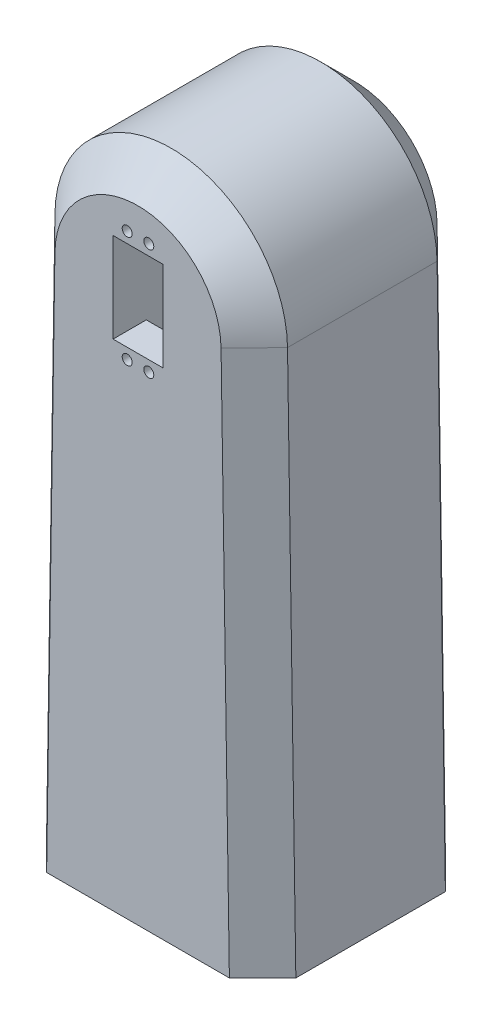
ISO-10303-21;
HEADER;
FILE_DESCRIPTION(('STEP AP214'),'2;1');
FILE_NAME('part.step','',(''),(''),'','','');
FILE_SCHEMA(('AUTOMOTIVE_DESIGN { 1 0 10303 214 1 1 1 1 }'));
ENDSEC;
DATA;
#1=APPLICATION_CONTEXT('core data for automotive mechanical design processes');
#2=APPLICATION_PROTOCOL_DEFINITION('international standard','automotive_design',2000,#1);
#3=PRODUCT_CONTEXT('',#1,'mechanical');
#4=PRODUCT('Part','Part','',(#3));
#5=PRODUCT_RELATED_PRODUCT_CATEGORY('part','',(#4));
#6=PRODUCT_DEFINITION_FORMATION('','',#4);
#7=PRODUCT_DEFINITION_CONTEXT('part definition',#1,'design');
#8=PRODUCT_DEFINITION('design','',#6,#7);
#9=PRODUCT_DEFINITION_SHAPE('','',#8);
#10=(LENGTH_UNIT() NAMED_UNIT(*) SI_UNIT(.MILLI.,.METRE.));
#11=(NAMED_UNIT(*) PLANE_ANGLE_UNIT() SI_UNIT($,.RADIAN.));
#12=(NAMED_UNIT(*) SI_UNIT($,.STERADIAN.) SOLID_ANGLE_UNIT());
#13=UNCERTAINTY_MEASURE_WITH_UNIT(LENGTH_MEASURE(1.E-05),#10,'distance_accuracy_value','');
#14=(GEOMETRIC_REPRESENTATION_CONTEXT(3) GLOBAL_UNCERTAINTY_ASSIGNED_CONTEXT((#13)) GLOBAL_UNIT_ASSIGNED_CONTEXT((#10,
#11,#12)) REPRESENTATION_CONTEXT('',''));
#15=CARTESIAN_POINT('',(0.,0.,0.));
#16=DIRECTION('',(0.,0.,1.));
#17=DIRECTION('',(1.,0.,0.));
#18=AXIS2_PLACEMENT_3D('',#15,#16,#17);
#19=CARTESIAN_POINT('',(0.,162.5,65.));
#20=DIRECTION('',(0.,0.,1.));
#21=DIRECTION('',(1.,0.,0.));
#22=AXIS2_PLACEMENT_3D('',#19,#20,#21);
#23=PLANE('',#22);
#24=CARTESIAN_POINT('',(-3.25,145.75,65.));
#25=DIRECTION('',(0.,0.,-1.));
#26=DIRECTION('',(-1.,0.,0.));
#27=AXIS2_PLACEMENT_3D('',#24,#25,#26);
#28=CIRCLE('',#27,1.5);
#29=CARTESIAN_POINT('',(-4.75000000000001,145.75,65.));
#30=VERTEX_POINT('',#29);
#31=EDGE_CURVE('E194',#30,#30,#28,.T.);
#32=ORIENTED_EDGE('',*,*,#31,.T.);
#33=EDGE_LOOP('',(#32));
#34=FACE_BOUND('',#33,.T.);
#35=CARTESIAN_POINT('',(-3.25,179.25,65.));
#36=DIRECTION('',(0.,0.,-1.));
#37=DIRECTION('',(-1.,0.,0.));
#38=AXIS2_PLACEMENT_3D('',#35,#36,#37);
#39=CIRCLE('',#38,1.5);
#40=CARTESIAN_POINT('',(-4.75000000000001,179.25,65.));
#41=VERTEX_POINT('',#40);
#42=EDGE_CURVE('E916',#41,#41,#39,.F.);
#43=ORIENTED_EDGE('',*,*,#42,.F.);
#44=EDGE_LOOP('',(#43));
#45=FACE_BOUND('',#44,.T.);
#46=CARTESIAN_POINT('',(3.25,179.25,65.));
#47=DIRECTION('',(0.,0.,-1.));
#48=DIRECTION('',(-1.,0.,0.));
#49=AXIS2_PLACEMENT_3D('',#46,#47,#48);
#50=CIRCLE('',#49,1.5);
#51=CARTESIAN_POINT('',(1.75,179.25,65.));
#52=VERTEX_POINT('',#51);
#53=EDGE_CURVE('E915',#52,#52,#50,.T.);
#54=ORIENTED_EDGE('',*,*,#53,.T.);
#55=EDGE_LOOP('',(#54));
#56=FACE_BOUND('',#55,.T.);
#57=CARTESIAN_POINT('',(0.,162.5,65.));
#58=DIRECTION('',(0.,0.,1.));
#59=DIRECTION('',(1.,0.,0.));
#60=AXIS2_PLACEMENT_3D('',#57,#58,#59);
#61=CIRCLE('',#60,24.9999999999999);
#62=CARTESIAN_POINT('',(24.997051704333,162.883935008692,65.));
#63=VERTEX_POINT('',#62);
#64=CARTESIAN_POINT('',(-24.997051704333,162.883935008692,65.));
#65=VERTEX_POINT('',#64);
#66=EDGE_CURVE('E354',#63,#65,#61,.T.);
#67=ORIENTED_EDGE('',*,*,#66,.T.);
#68=DIRECTION('',(-0.0153574003476897,-0.999882068173323,0.));
#69=VECTOR('',#68,1.);
#70=CARTESIAN_POINT('',(-27.5011793182667,-0.153574003476899,65.));
#71=LINE('',#70,#69);
#72=CARTESIAN_POINT('',(-27.4988205426376,0.,65.));
#73=VERTEX_POINT('',#72);
#74=EDGE_CURVE('E360',#65,#73,#71,.T.);
#75=ORIENTED_EDGE('',*,*,#74,.T.);
#76=DIRECTION('',(1.,0.,0.));
#77=VECTOR('',#76,1.);
#78=CARTESIAN_POINT('',(-37.5,0.,65.));
#79=LINE('',#78,#77);
#80=CARTESIAN_POINT('',(27.4988205426376,0.,65.));
#81=VERTEX_POINT('',#80);
#82=EDGE_CURVE('E289',#73,#81,#79,.T.);
#83=ORIENTED_EDGE('',*,*,#82,.T.);
#84=DIRECTION('',(-0.0153574003476897,0.999882068173323,0.));
#85=VECTOR('',#84,1.);
#86=CARTESIAN_POINT('',(24.997051704333,162.883935008692,65.));
#87=LINE('',#86,#85);
#88=EDGE_CURVE('E357',#81,#63,#87,.T.);
#89=ORIENTED_EDGE('',*,*,#88,.T.);
#90=EDGE_LOOP('',(#67,#75,#83,#89));
#91=FACE_BOUND('',#90,.T.);
#92=DIRECTION('',(0.,-1.,0.));
#93=VECTOR('',#92,1.);
#94=CARTESIAN_POINT('',(7.49999999999997,0.,65.));
#95=LINE('',#94,#93);
#96=CARTESIAN_POINT('',(7.5,176.,65.));
#97=VERTEX_POINT('',#96);
#98=CARTESIAN_POINT('',(7.49999999999999,149.,65.));
#99=VERTEX_POINT('',#98);
#100=EDGE_CURVE('E174',#97,#99,#95,.T.);
#101=ORIENTED_EDGE('',*,*,#100,.T.);
#102=DIRECTION('',(1.,0.,0.));
#103=VECTOR('',#102,1.);
#104=CARTESIAN_POINT('',(0.,149.,65.));
#105=LINE('',#104,#103);
#106=CARTESIAN_POINT('',(-7.50000000000001,149.,65.));
#107=VERTEX_POINT('',#106);
#108=EDGE_CURVE('E168',#107,#99,#105,.T.);
#109=ORIENTED_EDGE('',*,*,#108,.F.);
#110=DIRECTION('',(0.,1.,0.));
#111=VECTOR('',#110,1.);
#112=CARTESIAN_POINT('',(-7.50000000000003,0.,65.));
#113=LINE('',#112,#111);
#114=CARTESIAN_POINT('',(-7.5,176.,65.));
#115=VERTEX_POINT('',#114);
#116=EDGE_CURVE('E177',#107,#115,#113,.T.);
#117=ORIENTED_EDGE('',*,*,#116,.T.);
#118=DIRECTION('',(-1.,0.,0.));
#119=VECTOR('',#118,1.);
#120=CARTESIAN_POINT('',(0.,176.,65.));
#121=LINE('',#120,#119);
#122=EDGE_CURVE('E183',#97,#115,#121,.T.);
#123=ORIENTED_EDGE('',*,*,#122,.F.);
#124=EDGE_LOOP('',(#101,#109,#117,#123));
#125=FACE_BOUND('',#124,.T.);
#126=CARTESIAN_POINT('',(3.25,145.75,65.));
#127=DIRECTION('',(0.,0.,-1.));
#128=DIRECTION('',(-1.,0.,0.));
#129=AXIS2_PLACEMENT_3D('',#126,#127,#128);
#130=CIRCLE('',#129,1.5);
#131=CARTESIAN_POINT('',(1.75,145.75,65.));
#132=VERTEX_POINT('',#131);
#133=EDGE_CURVE('E930',#132,#132,#130,.F.);
#134=ORIENTED_EDGE('',*,*,#133,.F.);
#135=EDGE_LOOP('',(#134));
#136=FACE_BOUND('',#135,.T.);
#137=ADVANCED_FACE('F52',(#34,#45,#56,#91,#125,#136),#23,.T.);
#138=CARTESIAN_POINT('',(0.,162.5,55.));
#139=DIRECTION('',(0.,0.,1.));
#140=DIRECTION('',(1.,0.,0.));
#141=AXIS2_PLACEMENT_3D('',#138,#139,#140);
#142=PLANE('',#141);
#143=CARTESIAN_POINT('',(3.25,145.75,55.));
#144=DIRECTION('',(0.,0.,-1.));
#145=DIRECTION('',(-1.,0.,0.));
#146=AXIS2_PLACEMENT_3D('',#143,#144,#145);
#147=CIRCLE('',#146,1.5);
#148=CARTESIAN_POINT('',(1.75,145.75,55.));
#149=VERTEX_POINT('',#148);
#150=EDGE_CURVE('E923',#149,#149,#147,.F.);
#151=ORIENTED_EDGE('',*,*,#150,.T.);
#152=EDGE_LOOP('',(#151));
#153=FACE_BOUND('',#152,.T.);
#154=CARTESIAN_POINT('',(-3.25,145.75,55.));
#155=DIRECTION('',(0.,0.,-1.));
#156=DIRECTION('',(-1.,0.,0.));
#157=AXIS2_PLACEMENT_3D('',#154,#155,#156);
#158=CIRCLE('',#157,1.5);
#159=CARTESIAN_POINT('',(-4.75000000000001,145.75,55.));
#160=VERTEX_POINT('',#159);
#161=EDGE_CURVE('E933',#160,#160,#158,.T.);
#162=ORIENTED_EDGE('',*,*,#161,.F.);
#163=EDGE_LOOP('',(#162));
#164=FACE_BOUND('',#163,.T.);
#165=DIRECTION('',(0.,1.,0.));
#166=VECTOR('',#165,1.);
#167=CARTESIAN_POINT('',(-7.5,182.5,55.));
#168=LINE('',#167,#166);
#169=CARTESIAN_POINT('',(-7.50000000000001,142.5,55.));
#170=VERTEX_POINT('',#169);
#171=CARTESIAN_POINT('',(-7.50000000000001,149.,55.));
#172=VERTEX_POINT('',#171);
#173=EDGE_CURVE('E232',#170,#172,#168,.T.);
#174=ORIENTED_EDGE('',*,*,#173,.T.);
#175=DIRECTION('',(1.,0.,0.));
#176=VECTOR('',#175,1.);
#177=CARTESIAN_POINT('',(0.,149.,55.));
#178=LINE('',#177,#176);
#179=CARTESIAN_POINT('',(7.49999999999999,149.,55.));
#180=VERTEX_POINT('',#179);
#181=EDGE_CURVE('E171',#172,#180,#178,.T.);
#182=ORIENTED_EDGE('',*,*,#181,.T.);
#183=DIRECTION('',(0.,-1.,0.));
#184=VECTOR('',#183,1.);
#185=CARTESIAN_POINT('',(7.5,182.5,55.));
#186=LINE('',#185,#184);
#187=CARTESIAN_POINT('',(7.49999999999999,142.5,55.));
#188=VERTEX_POINT('',#187);
#189=EDGE_CURVE('E247',#180,#188,#186,.T.);
#190=ORIENTED_EDGE('',*,*,#189,.T.);
#191=DIRECTION('',(-1.,0.,0.));
#192=VECTOR('',#191,1.);
#193=CARTESIAN_POINT('',(7.49999999999999,142.5,55.));
#194=LINE('',#193,#192);
#195=EDGE_CURVE('E237',#188,#170,#194,.T.);
#196=ORIENTED_EDGE('',*,*,#195,.T.);
#197=EDGE_LOOP('',(#174,#182,#190,#196));
#198=FACE_BOUND('',#197,.T.);
#199=ADVANCED_FACE('F436',(#153,#164,#198),#142,.F.);
#200=CARTESIAN_POINT('',(3.25,179.25,55.));
#201=DIRECTION('',(0.,0.,-1.));
#202=DIRECTION('',(-1.,0.,0.));
#203=AXIS2_PLACEMENT_3D('',#200,#201,#202);
#204=CIRCLE('',#203,1.5);
#205=CARTESIAN_POINT('',(1.75,179.25,55.));
#206=VERTEX_POINT('',#205);
#207=EDGE_CURVE('E202',#206,#206,#204,.T.);
#208=ORIENTED_EDGE('',*,*,#207,.F.);
#209=EDGE_LOOP('',(#208));
#210=FACE_BOUND('',#209,.T.);
#211=CARTESIAN_POINT('',(7.5,182.5,55.));
#212=VERTEX_POINT('',#211);
#213=CARTESIAN_POINT('',(7.5,176.,55.));
#214=VERTEX_POINT('',#213);
#215=EDGE_CURVE('E243',#212,#214,#186,.T.);
#216=ORIENTED_EDGE('',*,*,#215,.T.);
#217=DIRECTION('',(-1.,0.,0.));
#218=VECTOR('',#217,1.);
#219=CARTESIAN_POINT('',(0.,176.,55.));
#220=LINE('',#219,#218);
#221=CARTESIAN_POINT('',(-7.5,176.,55.));
#222=VERTEX_POINT('',#221);
#223=EDGE_CURVE('E189',#214,#222,#220,.T.);
#224=ORIENTED_EDGE('',*,*,#223,.T.);
#225=CARTESIAN_POINT('',(-7.5,182.5,55.));
#226=VERTEX_POINT('',#225);
#227=EDGE_CURVE('E236',#222,#226,#168,.T.);
#228=ORIENTED_EDGE('',*,*,#227,.T.);
#229=DIRECTION('',(1.,0.,0.));
#230=VECTOR('',#229,1.);
#231=CARTESIAN_POINT('',(7.5,182.5,55.));
#232=LINE('',#231,#230);
#233=EDGE_CURVE('E216',#226,#212,#232,.T.);
#234=ORIENTED_EDGE('',*,*,#233,.T.);
#235=EDGE_LOOP('',(#216,#224,#228,#234));
#236=FACE_BOUND('',#235,.T.);
#237=CARTESIAN_POINT('',(-3.25,179.25,55.));
#238=DIRECTION('',(0.,0.,-1.));
#239=DIRECTION('',(-1.,0.,0.));
#240=AXIS2_PLACEMENT_3D('',#237,#238,#239);
#241=CIRCLE('',#240,1.5);
#242=CARTESIAN_POINT('',(-4.75000000000001,179.25,55.));
#243=VERTEX_POINT('',#242);
#244=EDGE_CURVE('E912',#243,#243,#241,.F.);
#245=ORIENTED_EDGE('',*,*,#244,.T.);
#246=EDGE_LOOP('',(#245));
#247=FACE_BOUND('',#246,.T.);
#248=ADVANCED_FACE('F442',(#210,#236,#247),#142,.F.);
#249=CARTESIAN_POINT('',(37.5,0.,65.));
#250=DIRECTION('',(-0.999882068173322,-0.0153574003476897,0.));
#251=DIRECTION('',(0.0153574003476897,-0.999882068173323,0.));
#252=AXIS2_PLACEMENT_3D('',#249,#250,#251);
#253=PLANE('',#252);
#254=DIRECTION('',(0.,0.,-1.));
#255=VECTOR('',#254,1.);
#256=CARTESIAN_POINT('',(37.5,0.,65.));
#257=LINE('',#256,#255);
#258=CARTESIAN_POINT('',(37.5,0.,54.9999999999999));
#259=VERTEX_POINT('',#258);
#260=CARTESIAN_POINT('',(37.5,0.,10.));
#261=VERTEX_POINT('',#260);
#262=EDGE_CURVE('E293',#259,#261,#257,.T.);
#263=ORIENTED_EDGE('',*,*,#262,.T.);
#264=DIRECTION('',(-0.0153574003476897,0.999882068173323,0.));
#265=VECTOR('',#264,1.);
#266=CARTESIAN_POINT('',(37.5,0.,10.));
#267=LINE('',#266,#265);
#268=CARTESIAN_POINT('',(34.9958723860663,163.037509012169,10.));
#269=VERTEX_POINT('',#268);
#270=EDGE_CURVE('E351',#261,#269,#267,.T.);
#271=ORIENTED_EDGE('',*,*,#270,.T.);
#272=DIRECTION('',(0.,0.,-1.));
#273=VECTOR('',#272,1.);
#274=CARTESIAN_POINT('',(34.9958723860663,163.037509012169,65.));
#275=LINE('',#274,#273);
#276=CARTESIAN_POINT('',(34.9958723860663,163.037509012169,54.9999999999999));
#277=VERTEX_POINT('',#276);
#278=EDGE_CURVE('E310',#277,#269,#275,.T.);
#279=ORIENTED_EDGE('',*,*,#278,.F.);
#280=DIRECTION('',(0.0153574003476897,-0.999882068173323,0.));
#281=VECTOR('',#280,1.);
#282=CARTESIAN_POINT('',(37.5,0.,54.9999999999999));
#283=LINE('',#282,#281);
#284=EDGE_CURVE('E348',#277,#259,#283,.T.);
#285=ORIENTED_EDGE('',*,*,#284,.T.);
#286=EDGE_LOOP('',(#263,#271,#279,#285));
#287=FACE_BOUND('',#286,.T.);
#288=ADVANCED_FACE('F462',(#287),#253,.F.);
#289=CARTESIAN_POINT('',(0.,162.5,65.));
#290=DIRECTION('',(0.,0.,-1.));
#291=DIRECTION('',(-1.,0.,0.));
#292=AXIS2_PLACEMENT_3D('',#289,#290,#291);
#293=CYLINDRICAL_SURFACE('',#292,35.);
#294=ORIENTED_EDGE('',*,*,#278,.T.);
#295=CARTESIAN_POINT('',(0.,162.5,10.));
#296=DIRECTION('',(0.,0.,1.));
#297=DIRECTION('',(1.,0.,0.));
#298=AXIS2_PLACEMENT_3D('',#295,#296,#297);
#299=CIRCLE('',#298,35.);
#300=CARTESIAN_POINT('',(-34.9958723860663,163.037509012169,10.));
#301=VERTEX_POINT('',#300);
#302=EDGE_CURVE('E345',#269,#301,#299,.T.);
#303=ORIENTED_EDGE('',*,*,#302,.T.);
#304=DIRECTION('',(0.,0.,-1.));
#305=VECTOR('',#304,1.);
#306=CARTESIAN_POINT('',(-34.9958723860663,163.037509012169,65.));
#307=LINE('',#306,#305);
#308=CARTESIAN_POINT('',(-34.9958723860663,163.037509012169,54.9999999999999));
#309=VERTEX_POINT('',#308);
#310=EDGE_CURVE('E306',#309,#301,#307,.T.);
#311=ORIENTED_EDGE('',*,*,#310,.F.);
#312=CARTESIAN_POINT('',(0.,162.5,54.9999999999999));
#313=DIRECTION('',(0.,0.,1.));
#314=DIRECTION('',(1.,0.,0.));
#315=AXIS2_PLACEMENT_3D('',#312,#313,#314);
#316=CIRCLE('',#315,35.);
#317=EDGE_CURVE('E342',#309,#277,#316,.F.);
#318=ORIENTED_EDGE('',*,*,#317,.T.);
#319=EDGE_LOOP('',(#294,#303,#311,#318));
#320=FACE_BOUND('',#319,.T.);
#321=ADVANCED_FACE('F458',(#320),#293,.T.);
#322=CARTESIAN_POINT('',(-37.5,0.,65.));
#323=DIRECTION('',(0.999882068173322,-0.0153574003476897,0.));
#324=DIRECTION('',(0.0153574003476897,0.999882068173323,0.));
#325=AXIS2_PLACEMENT_3D('',#322,#323,#324);
#326=PLANE('',#325);
#327=ORIENTED_EDGE('',*,*,#310,.T.);
#328=DIRECTION('',(-0.0153574003476897,-0.999882068173323,0.));
#329=VECTOR('',#328,1.);
#330=CARTESIAN_POINT('',(-37.5,0.,10.));
#331=LINE('',#330,#329);
#332=CARTESIAN_POINT('',(-37.5,0.,10.));
#333=VERTEX_POINT('',#332);
#334=EDGE_CURVE('E317',#301,#333,#331,.T.);
#335=ORIENTED_EDGE('',*,*,#334,.T.);
#336=DIRECTION('',(0.,0.,-1.));
#337=VECTOR('',#336,1.);
#338=CARTESIAN_POINT('',(-37.5,0.,65.));
#339=LINE('',#338,#337);
#340=CARTESIAN_POINT('',(-37.5,0.,54.9999999999999));
#341=VERTEX_POINT('',#340);
#342=EDGE_CURVE('E302',#341,#333,#339,.T.);
#343=ORIENTED_EDGE('',*,*,#342,.F.);
#344=DIRECTION('',(0.0153574003476897,0.999882068173323,0.));
#345=VECTOR('',#344,1.);
#346=CARTESIAN_POINT('',(-34.9958723860663,163.037509012169,54.9999999999999));
#347=LINE('',#346,#345);
#348=EDGE_CURVE('E314',#341,#309,#347,.T.);
#349=ORIENTED_EDGE('',*,*,#348,.T.);
#350=EDGE_LOOP('',(#327,#335,#343,#349));
#351=FACE_BOUND('',#350,.T.);
#352=ADVANCED_FACE('F455',(#351),#326,.F.);
#353=CARTESIAN_POINT('',(-37.5,0.,65.));
#354=DIRECTION('',(0.,1.,0.));
#355=DIRECTION('',(0.,0.,1.));
#356=AXIS2_PLACEMENT_3D('',#353,#354,#355);
#357=PLANE('',#356);
#358=CARTESIAN_POINT('',(0.,0.,32.5));
#359=DIRECTION('',(0.,1.,0.));
#360=DIRECTION('',(0.,0.,1.));
#361=AXIS2_PLACEMENT_3D('',#358,#359,#360);
#362=CIRCLE('',#361,16.);
#363=CARTESIAN_POINT('',(0.,0.,48.5));
#364=VERTEX_POINT('',#363);
#365=EDGE_CURVE('E61',#364,#364,#362,.T.);
#366=ORIENTED_EDGE('',*,*,#365,.T.);
#367=EDGE_LOOP('',(#366));
#368=FACE_BOUND('',#367,.T.);
#369=ORIENTED_EDGE('',*,*,#342,.T.);
#370=DIRECTION('',(-0.707148477612954,0.,0.707065082301256));
#371=VECTOR('',#370,1.);
#372=CARTESIAN_POINT('',(-37.5,0.,10.));
#373=LINE('',#372,#371);
#374=CARTESIAN_POINT('',(-27.4988205426376,0.,0.));
#375=VERTEX_POINT('',#374);
#376=EDGE_CURVE('E330',#333,#375,#373,.F.);
#377=ORIENTED_EDGE('',*,*,#376,.T.);
#378=DIRECTION('',(1.,0.,0.));
#379=VECTOR('',#378,1.);
#380=CARTESIAN_POINT('',(-37.5,0.,0.));
#381=LINE('',#380,#379);
#382=CARTESIAN_POINT('',(27.4988205426376,0.,0.));
#383=VERTEX_POINT('',#382);
#384=EDGE_CURVE('E294',#375,#383,#381,.T.);
#385=ORIENTED_EDGE('',*,*,#384,.T.);
#386=DIRECTION('',(-0.707148477612954,0.,-0.707065082301256));
#387=VECTOR('',#386,1.);
#388=CARTESIAN_POINT('',(37.5,0.,10.));
#389=LINE('',#388,#387);
#390=EDGE_CURVE('E327',#383,#261,#389,.F.);
#391=ORIENTED_EDGE('',*,*,#390,.T.);
#392=ORIENTED_EDGE('',*,*,#262,.F.);
#393=DIRECTION('',(-0.707148477612954,0.,0.707065082301256));
#394=VECTOR('',#393,1.);
#395=CARTESIAN_POINT('',(26.2477885957022,0.,66.2508844104527));
#396=LINE('',#395,#394);
#397=EDGE_CURVE('E321',#259,#81,#396,.T.);
#398=ORIENTED_EDGE('',*,*,#397,.T.);
#399=ORIENTED_EDGE('',*,*,#82,.F.);
#400=DIRECTION('',(-0.707148477612954,0.,-0.707065082301256));
#401=VECTOR('',#400,1.);
#402=CARTESIAN_POINT('',(-26.2477885957022,0.,66.2508844104527));
#403=LINE('',#402,#401);
#404=EDGE_CURVE('E324',#73,#341,#403,.T.);
#405=ORIENTED_EDGE('',*,*,#404,.T.);
#406=EDGE_LOOP('',(#369,#377,#385,#391,#392,#398,#399,#405));
#407=FACE_BOUND('',#406,.T.);
#408=ADVANCED_FACE('F389',(#368,#407),#357,.F.);
#409=CARTESIAN_POINT('',(0.,162.5,0.));
#410=DIRECTION('',(0.,0.,1.));
#411=DIRECTION('',(1.,0.,0.));
#412=AXIS2_PLACEMENT_3D('',#409,#410,#411);
#413=PLANE('',#412);
#414=DIRECTION('',(0.,-1.,0.));
#415=VECTOR('',#414,1.);
#416=CARTESIAN_POINT('',(7.5,182.5,0.));
#417=LINE('',#416,#415);
#418=CARTESIAN_POINT('',(7.5,182.5,0.));
#419=VERTEX_POINT('',#418);
#420=CARTESIAN_POINT('',(7.49999999999999,142.5,0.));
#421=VERTEX_POINT('',#420);
#422=EDGE_CURVE('E217',#419,#421,#417,.T.);
#423=ORIENTED_EDGE('',*,*,#422,.F.);
#424=DIRECTION('',(1.,0.,0.));
#425=VECTOR('',#424,1.);
#426=CARTESIAN_POINT('',(7.5,182.5,0.));
#427=LINE('',#426,#425);
#428=CARTESIAN_POINT('',(-7.5,182.5,0.));
#429=VERTEX_POINT('',#428);
#430=EDGE_CURVE('E221',#429,#419,#427,.T.);
#431=ORIENTED_EDGE('',*,*,#430,.F.);
#432=DIRECTION('',(0.,1.,0.));
#433=VECTOR('',#432,1.);
#434=CARTESIAN_POINT('',(-7.5,182.5,0.));
#435=LINE('',#434,#433);
#436=CARTESIAN_POINT('',(-7.50000000000001,142.5,0.));
#437=VERTEX_POINT('',#436);
#438=EDGE_CURVE('E207',#437,#429,#435,.T.);
#439=ORIENTED_EDGE('',*,*,#438,.F.);
#440=DIRECTION('',(-1.,0.,0.));
#441=VECTOR('',#440,1.);
#442=CARTESIAN_POINT('',(7.49999999999999,142.5,0.));
#443=LINE('',#442,#441);
#444=EDGE_CURVE('E213',#421,#437,#443,.T.);
#445=ORIENTED_EDGE('',*,*,#444,.F.);
#446=EDGE_LOOP('',(#423,#431,#439,#445));
#447=FACE_BOUND('',#446,.T.);
#448=ORIENTED_EDGE('',*,*,#384,.F.);
#449=DIRECTION('',(0.0153574003476897,0.999882068173323,0.));
#450=VECTOR('',#449,1.);
#451=CARTESIAN_POINT('',(-24.9970517043331,162.883935008692,0.));
#452=LINE('',#451,#450);
#453=CARTESIAN_POINT('',(-24.9970517043331,162.883935008692,0.));
#454=VERTEX_POINT('',#453);
#455=EDGE_CURVE('E339',#375,#454,#452,.T.);
#456=ORIENTED_EDGE('',*,*,#455,.T.);
#457=CARTESIAN_POINT('',(0.,162.5,0.));
#458=DIRECTION('',(0.,0.,1.));
#459=DIRECTION('',(1.,0.,0.));
#460=AXIS2_PLACEMENT_3D('',#457,#458,#459);
#461=CIRCLE('',#460,25.);
#462=CARTESIAN_POINT('',(24.9970517043331,162.883935008692,0.));
#463=VERTEX_POINT('',#462);
#464=EDGE_CURVE('E336',#454,#463,#461,.F.);
#465=ORIENTED_EDGE('',*,*,#464,.T.);
#466=DIRECTION('',(0.0153574003476897,-0.999882068173323,0.));
#467=VECTOR('',#466,1.);
#468=CARTESIAN_POINT('',(24.9970517043331,162.883935008692,0.));
#469=LINE('',#468,#467);
#470=EDGE_CURVE('E333',#463,#383,#469,.T.);
#471=ORIENTED_EDGE('',*,*,#470,.T.);
#472=EDGE_LOOP('',(#448,#456,#465,#471));
#473=FACE_BOUND('',#472,.T.);
#474=ADVANCED_FACE('F448',(#447,#473),#413,.F.);
#475=CARTESIAN_POINT('',(37.5,0.,10.));
#476=DIRECTION('',(-0.707023390792186,-0.010859321927248,0.707106781186548));
#477=DIRECTION('',(-0.0153574003476897,0.999882068173323,0.));
#478=AXIS2_PLACEMENT_3D('',#475,#476,#477);
#479=PLANE('',#478);
#480=ORIENTED_EDGE('',*,*,#390,.F.);
#481=ORIENTED_EDGE('',*,*,#470,.F.);
#482=DIRECTION('',(-0.707023390792186,-0.0108593219272465,-0.707106781186547));
#483=VECTOR('',#482,1.);
#484=CARTESIAN_POINT('',(34.9958723860663,163.037509012169,10.));
#485=LINE('',#484,#483);
#486=EDGE_CURVE('E298',#269,#463,#485,.T.);
#487=ORIENTED_EDGE('',*,*,#486,.F.);
#488=ORIENTED_EDGE('',*,*,#270,.F.);
#489=EDGE_LOOP('',(#480,#481,#487,#488));
#490=FACE_BOUND('',#489,.T.);
#491=ADVANCED_FACE('F451',(#490),#479,.F.);
#492=CARTESIAN_POINT('',(0.,162.5,10.));
#493=DIRECTION('',(0.,0.,1.));
#494=DIRECTION('',(1.,0.,0.));
#495=AXIS2_PLACEMENT_3D('',#492,#493,#494);
#496=CONICAL_SURFACE('',#495,35.,0.785398163397449);
#497=ORIENTED_EDGE('',*,*,#486,.T.);
#498=ORIENTED_EDGE('',*,*,#464,.F.);
#499=DIRECTION('',(0.707023390792186,-0.0108593219272484,-0.707106781186547));
#500=VECTOR('',#499,1.);
#501=CARTESIAN_POINT('',(-34.9958723860663,163.037509012169,10.));
#502=LINE('',#501,#500);
#503=EDGE_CURVE('E365',#301,#454,#502,.T.);
#504=ORIENTED_EDGE('',*,*,#503,.F.);
#505=ORIENTED_EDGE('',*,*,#302,.F.);
#506=EDGE_LOOP('',(#497,#498,#504,#505));
#507=FACE_BOUND('',#506,.T.);
#508=ADVANCED_FACE('F476',(#507),#496,.T.);
#509=CARTESIAN_POINT('',(-37.5,0.,10.));
#510=DIRECTION('',(0.707023390792186,-0.010859321927248,0.707106781186548));
#511=DIRECTION('',(-0.0153574003476897,-0.999882068173323,0.));
#512=AXIS2_PLACEMENT_3D('',#509,#510,#511);
#513=PLANE('',#512);
#514=ORIENTED_EDGE('',*,*,#503,.T.);
#515=ORIENTED_EDGE('',*,*,#455,.F.);
#516=ORIENTED_EDGE('',*,*,#376,.F.);
#517=ORIENTED_EDGE('',*,*,#334,.F.);
#518=EDGE_LOOP('',(#514,#515,#516,#517));
#519=FACE_BOUND('',#518,.T.);
#520=ADVANCED_FACE('F468',(#519),#513,.F.);
#521=CARTESIAN_POINT('',(24.997051704333,162.883935008692,65.));
#522=DIRECTION('',(0.707023390792186,0.010859321927248,0.707106781186548));
#523=DIRECTION('',(0.0153574003476897,-0.999882068173323,0.));
#524=AXIS2_PLACEMENT_3D('',#521,#522,#523);
#525=PLANE('',#524);
#526=ORIENTED_EDGE('',*,*,#397,.F.);
#527=ORIENTED_EDGE('',*,*,#284,.F.);
#528=DIRECTION('',(0.707023390792186,0.0108593219272484,-0.707106781186547));
#529=VECTOR('',#528,1.);
#530=CARTESIAN_POINT('',(24.997051704333,162.883935008692,65.));
#531=LINE('',#530,#529);
#532=EDGE_CURVE('E369',#63,#277,#531,.T.);
#533=ORIENTED_EDGE('',*,*,#532,.F.);
#534=ORIENTED_EDGE('',*,*,#88,.F.);
#535=EDGE_LOOP('',(#526,#527,#533,#534));
#536=FACE_BOUND('',#535,.T.);
#537=ADVANCED_FACE('F475',(#536),#525,.T.);
#538=CARTESIAN_POINT('',(0.,162.5,65.));
#539=DIRECTION('',(0.,0.,-1.));
#540=DIRECTION('',(-1.,0.,0.));
#541=AXIS2_PLACEMENT_3D('',#538,#539,#540);
#542=CONICAL_SURFACE('',#541,24.9999999999999,0.785398163397449);
#543=ORIENTED_EDGE('',*,*,#532,.T.);
#544=ORIENTED_EDGE('',*,*,#317,.F.);
#545=DIRECTION('',(-0.707023390792186,0.0108593219272484,-0.707106781186547));
#546=VECTOR('',#545,1.);
#547=CARTESIAN_POINT('',(-24.997051704333,162.883935008692,65.));
#548=LINE('',#547,#546);
#549=EDGE_CURVE('E261',#65,#309,#548,.T.);
#550=ORIENTED_EDGE('',*,*,#549,.F.);
#551=ORIENTED_EDGE('',*,*,#66,.F.);
#552=EDGE_LOOP('',(#543,#544,#550,#551));
#553=FACE_BOUND('',#552,.T.);
#554=ADVANCED_FACE('F495',(#553),#542,.T.);
#555=CARTESIAN_POINT('',(-24.997051704333,162.883935008692,65.));
#556=DIRECTION('',(-0.707023390792186,0.010859321927248,0.707106781186548));
#557=DIRECTION('',(0.0153574003476897,0.999882068173323,0.));
#558=AXIS2_PLACEMENT_3D('',#555,#556,#557);
#559=PLANE('',#558);
#560=ORIENTED_EDGE('',*,*,#549,.T.);
#561=ORIENTED_EDGE('',*,*,#348,.F.);
#562=ORIENTED_EDGE('',*,*,#404,.F.);
#563=ORIENTED_EDGE('',*,*,#74,.F.);
#564=EDGE_LOOP('',(#560,#561,#562,#563));
#565=FACE_BOUND('',#564,.T.);
#566=ADVANCED_FACE('F402',(#565),#559,.T.);
#567=CARTESIAN_POINT('',(0.,5.,32.5));
#568=DIRECTION('',(0.,-1.,0.));
#569=DIRECTION('',(0.,0.,-1.));
#570=AXIS2_PLACEMENT_3D('',#567,#568,#569);
#571=CYLINDRICAL_SURFACE('',#570,15.);
#572=CARTESIAN_POINT('',(0.,1.,32.5));
#573=DIRECTION('',(0.,1.,0.));
#574=DIRECTION('',(0.,0.,1.));
#575=AXIS2_PLACEMENT_3D('',#572,#573,#574);
#576=CIRCLE('',#575,15.);
#577=CARTESIAN_POINT('',(0.,1.,47.5));
#578=VERTEX_POINT('',#577);
#579=EDGE_CURVE('E382',#578,#578,#576,.F.);
#580=ORIENTED_EDGE('',*,*,#579,.T.);
#581=EDGE_LOOP('',(#580));
#582=FACE_BOUND('',#581,.T.);
#583=CARTESIAN_POINT('',(0.,4.,32.5));
#584=DIRECTION('',(0.,-1.,0.));
#585=DIRECTION('',(0.,0.,-1.));
#586=AXIS2_PLACEMENT_3D('',#583,#584,#585);
#587=CIRCLE('',#586,15.);
#588=CARTESIAN_POINT('',(0.,4.,17.5));
#589=VERTEX_POINT('',#588);
#590=EDGE_CURVE('E364',#589,#589,#587,.F.);
#591=ORIENTED_EDGE('',*,*,#590,.T.);
#592=EDGE_LOOP('',(#591));
#593=FACE_BOUND('',#592,.T.);
#594=ADVANCED_FACE('F398',(#582,#593),#571,.F.);
#595=CARTESIAN_POINT('',(0.,5.,32.5));
#596=DIRECTION('',(0.,-1.,0.));
#597=DIRECTION('',(0.,0.,-1.));
#598=AXIS2_PLACEMENT_3D('',#595,#596,#597);
#599=PLANE('',#598);
#600=CARTESIAN_POINT('',(0.,5.,32.5));
#601=DIRECTION('',(0.,-1.,0.));
#602=DIRECTION('',(0.,0.,-1.));
#603=AXIS2_PLACEMENT_3D('',#600,#601,#602);
#604=CIRCLE('',#603,14.);
#605=CARTESIAN_POINT('',(0.,5.,18.5));
#606=VERTEX_POINT('',#605);
#607=EDGE_CURVE('E13',#606,#606,#604,.T.);
#608=ORIENTED_EDGE('',*,*,#607,.T.);
#609=EDGE_LOOP('',(#608));
#610=FACE_BOUND('',#609,.T.);
#611=CARTESIAN_POINT('',(0.,5.,40.));
#612=DIRECTION('',(0.,-1.,0.));
#613=DIRECTION('',(0.,0.,-1.));
#614=AXIS2_PLACEMENT_3D('',#611,#612,#613);
#615=CIRCLE('',#614,1.5);
#616=CARTESIAN_POINT('',(0.,5.,38.5));
#617=VERTEX_POINT('',#616);
#618=EDGE_CURVE('E262',#617,#617,#615,.T.);
#619=ORIENTED_EDGE('',*,*,#618,.F.);
#620=EDGE_LOOP('',(#619));
#621=FACE_BOUND('',#620,.T.);
#622=CARTESIAN_POINT('',(7.50000000000001,5.,32.5));
#623=DIRECTION('',(0.,-1.,0.));
#624=DIRECTION('',(0.,0.,-1.));
#625=AXIS2_PLACEMENT_3D('',#622,#623,#624);
#626=CIRCLE('',#625,1.49999999999996);
#627=CARTESIAN_POINT('',(7.50000000000001,5.,31.0000000000001));
#628=VERTEX_POINT('',#627);
#629=EDGE_CURVE('E266',#628,#628,#626,.T.);
#630=ORIENTED_EDGE('',*,*,#629,.F.);
#631=EDGE_LOOP('',(#630));
#632=FACE_BOUND('',#631,.T.);
#633=CARTESIAN_POINT('',(0.,5.,25.));
#634=DIRECTION('',(0.,-1.,0.));
#635=DIRECTION('',(0.,0.,-1.));
#636=AXIS2_PLACEMENT_3D('',#633,#634,#635);
#637=CIRCLE('',#636,1.5);
#638=CARTESIAN_POINT('',(0.,5.,23.5));
#639=VERTEX_POINT('',#638);
#640=EDGE_CURVE('E274',#639,#639,#637,.T.);
#641=ORIENTED_EDGE('',*,*,#640,.F.);
#642=EDGE_LOOP('',(#641));
#643=FACE_BOUND('',#642,.T.);
#644=CARTESIAN_POINT('',(-7.49999999999999,5.,32.5));
#645=DIRECTION('',(0.,-1.,0.));
#646=DIRECTION('',(0.,0.,-1.));
#647=AXIS2_PLACEMENT_3D('',#644,#645,#646);
#648=CIRCLE('',#647,1.49999999999993);
#649=CARTESIAN_POINT('',(-7.49999999999999,5.,31.0000000000001));
#650=VERTEX_POINT('',#649);
#651=EDGE_CURVE('E282',#650,#650,#648,.T.);
#652=ORIENTED_EDGE('',*,*,#651,.F.);
#653=EDGE_LOOP('',(#652));
#654=FACE_BOUND('',#653,.T.);
#655=ADVANCED_FACE('F401',(#610,#621,#632,#643,#654),#599,.T.);
#656=CARTESIAN_POINT('',(-7.49999999999999,12.5,32.5));
#657=DIRECTION('',(0.,-1.,0.));
#658=DIRECTION('',(0.,0.,-1.));
#659=AXIS2_PLACEMENT_3D('',#656,#657,#658);
#660=CYLINDRICAL_SURFACE('',#659,1.49999999999993);
#661=CARTESIAN_POINT('',(-7.49999999999999,12.5,32.5));
#662=DIRECTION('',(0.,-1.,0.));
#663=DIRECTION('',(0.,0.,-1.));
#664=AXIS2_PLACEMENT_3D('',#661,#662,#663);
#665=CIRCLE('',#664,1.49999999999993);
#666=CARTESIAN_POINT('',(-7.49999999999999,12.5,31.0000000000001));
#667=VERTEX_POINT('',#666);
#668=EDGE_CURVE('E256',#667,#667,#665,.T.);
#669=ORIENTED_EDGE('',*,*,#668,.F.);
#670=EDGE_LOOP('',(#669));
#671=FACE_BOUND('',#670,.T.);
#672=ORIENTED_EDGE('',*,*,#651,.T.);
#673=EDGE_LOOP('',(#672));
#674=FACE_BOUND('',#673,.T.);
#675=ADVANCED_FACE('F413',(#671,#674),#660,.F.);
#676=CARTESIAN_POINT('',(-7.49999999999999,12.5,32.5));
#677=DIRECTION('',(0.,-1.,0.));
#678=DIRECTION('',(0.,0.,-1.));
#679=AXIS2_PLACEMENT_3D('',#676,#677,#678);
#680=PLANE('',#679);
#681=ORIENTED_EDGE('',*,*,#668,.T.);
#682=EDGE_LOOP('',(#681));
#683=FACE_BOUND('',#682,.T.);
#684=ADVANCED_FACE('F424',(#683),#680,.T.);
#685=CARTESIAN_POINT('',(0.,12.5,25.));
#686=DIRECTION('',(0.,-1.,0.));
#687=DIRECTION('',(0.,0.,-1.));
#688=AXIS2_PLACEMENT_3D('',#685,#686,#687);
#689=CYLINDRICAL_SURFACE('',#688,1.5);
#690=CARTESIAN_POINT('',(0.,12.5,25.));
#691=DIRECTION('',(0.,-1.,0.));
#692=DIRECTION('',(0.,0.,-1.));
#693=AXIS2_PLACEMENT_3D('',#690,#691,#692);
#694=CIRCLE('',#693,1.5);
#695=CARTESIAN_POINT('',(0.,12.5,23.5));
#696=VERTEX_POINT('',#695);
#697=EDGE_CURVE('E278',#696,#696,#694,.T.);
#698=ORIENTED_EDGE('',*,*,#697,.F.);
#699=EDGE_LOOP('',(#698));
#700=FACE_BOUND('',#699,.T.);
#701=ORIENTED_EDGE('',*,*,#640,.T.);
#702=EDGE_LOOP('',(#701));
#703=FACE_BOUND('',#702,.T.);
#704=ADVANCED_FACE('F430',(#700,#703),#689,.F.);
#705=CARTESIAN_POINT('',(0.,12.5,25.));
#706=DIRECTION('',(0.,-1.,0.));
#707=DIRECTION('',(0.,0.,-1.));
#708=AXIS2_PLACEMENT_3D('',#705,#706,#707);
#709=PLANE('',#708);
#710=ORIENTED_EDGE('',*,*,#697,.T.);
#711=EDGE_LOOP('',(#710));
#712=FACE_BOUND('',#711,.T.);
#713=ADVANCED_FACE('F729',(#712),#709,.T.);
#714=CARTESIAN_POINT('',(7.50000000000001,12.5,32.5));
#715=DIRECTION('',(0.,-1.,0.));
#716=DIRECTION('',(0.,0.,-1.));
#717=AXIS2_PLACEMENT_3D('',#714,#715,#716);
#718=CYLINDRICAL_SURFACE('',#717,1.49999999999996);
#719=CARTESIAN_POINT('',(7.50000000000001,12.5,32.5));
#720=DIRECTION('',(0.,-1.,0.));
#721=DIRECTION('',(0.,0.,-1.));
#722=AXIS2_PLACEMENT_3D('',#719,#720,#721);
#723=CIRCLE('',#722,1.49999999999996);
#724=CARTESIAN_POINT('',(7.50000000000001,12.5,31.0000000000001));
#725=VERTEX_POINT('',#724);
#726=EDGE_CURVE('E270',#725,#725,#723,.T.);
#727=ORIENTED_EDGE('',*,*,#726,.F.);
#728=EDGE_LOOP('',(#727));
#729=FACE_BOUND('',#728,.T.);
#730=ORIENTED_EDGE('',*,*,#629,.T.);
#731=EDGE_LOOP('',(#730));
#732=FACE_BOUND('',#731,.T.);
#733=ADVANCED_FACE('F726',(#729,#732),#718,.F.);
#734=CARTESIAN_POINT('',(7.50000000000001,12.5,32.5));
#735=DIRECTION('',(0.,-1.,0.));
#736=DIRECTION('',(0.,0.,-1.));
#737=AXIS2_PLACEMENT_3D('',#734,#735,#736);
#738=PLANE('',#737);
#739=ORIENTED_EDGE('',*,*,#726,.T.);
#740=EDGE_LOOP('',(#739));
#741=FACE_BOUND('',#740,.T.);
#742=ADVANCED_FACE('F724',(#741),#738,.T.);
#743=CARTESIAN_POINT('',(0.,12.5,40.));
#744=DIRECTION('',(0.,-1.,0.));
#745=DIRECTION('',(0.,0.,-1.));
#746=AXIS2_PLACEMENT_3D('',#743,#744,#745);
#747=CYLINDRICAL_SURFACE('',#746,1.5);
#748=CARTESIAN_POINT('',(0.,12.5,40.));
#749=DIRECTION('',(0.,-1.,0.));
#750=DIRECTION('',(0.,0.,-1.));
#751=AXIS2_PLACEMENT_3D('',#748,#749,#750);
#752=CIRCLE('',#751,1.5);
#753=CARTESIAN_POINT('',(0.,12.5,38.5));
#754=VERTEX_POINT('',#753);
#755=EDGE_CURVE('E257',#754,#754,#752,.T.);
#756=ORIENTED_EDGE('',*,*,#755,.F.);
#757=EDGE_LOOP('',(#756));
#758=FACE_BOUND('',#757,.T.);
#759=ORIENTED_EDGE('',*,*,#618,.T.);
#760=EDGE_LOOP('',(#759));
#761=FACE_BOUND('',#760,.T.);
#762=ADVANCED_FACE('F720',(#758,#761),#747,.F.);
#763=CARTESIAN_POINT('',(0.,12.5,40.));
#764=DIRECTION('',(0.,-1.,0.));
#765=DIRECTION('',(0.,0.,-1.));
#766=AXIS2_PLACEMENT_3D('',#763,#764,#765);
#767=PLANE('',#766);
#768=ORIENTED_EDGE('',*,*,#755,.T.);
#769=EDGE_LOOP('',(#768));
#770=FACE_BOUND('',#769,.T.);
#771=ADVANCED_FACE('F395',(#770),#767,.T.);
#772=CARTESIAN_POINT('',(0.,1.,32.5));
#773=DIRECTION('',(0.,1.,0.));
#774=DIRECTION('',(0.,0.,1.));
#775=AXIS2_PLACEMENT_3D('',#772,#773,#774);
#776=TOROIDAL_SURFACE('',#775,16.,1.);
#777=ORIENTED_EDGE('',*,*,#365,.F.);
#778=EDGE_LOOP('',(#777));
#779=FACE_BOUND('',#778,.T.);
#780=ORIENTED_EDGE('',*,*,#579,.F.);
#781=EDGE_LOOP('',(#780));
#782=FACE_BOUND('',#781,.T.);
#783=ADVANCED_FACE('F392',(#779,#782),#776,.T.);
#784=CARTESIAN_POINT('',(0.,4.,32.5));
#785=DIRECTION('',(0.,-1.,0.));
#786=DIRECTION('',(0.,0.,-1.));
#787=AXIS2_PLACEMENT_3D('',#784,#785,#786);
#788=TOROIDAL_SURFACE('',#787,14.,1.);
#789=ORIENTED_EDGE('',*,*,#590,.F.);
#790=EDGE_LOOP('',(#789));
#791=FACE_BOUND('',#790,.T.);
#792=ORIENTED_EDGE('',*,*,#607,.F.);
#793=EDGE_LOOP('',(#792));
#794=FACE_BOUND('',#793,.T.);
#795=ADVANCED_FACE('F54',(#791,#794),#788,.F.);
#796=CARTESIAN_POINT('',(7.5,182.5,107.720018726588));
#797=DIRECTION('',(0.,1.,0.));
#798=DIRECTION('',(0.,0.,1.));
#799=AXIS2_PLACEMENT_3D('',#796,#797,#798);
#800=PLANE('',#799);
#801=DIRECTION('',(0.,0.,-1.));
#802=VECTOR('',#801,1.);
#803=CARTESIAN_POINT('',(-7.5,182.5,107.720018726588));
#804=LINE('',#803,#802);
#805=EDGE_CURVE('E235',#226,#429,#804,.T.);
#806=ORIENTED_EDGE('',*,*,#805,.T.);
#807=ORIENTED_EDGE('',*,*,#430,.T.);
#808=DIRECTION('',(0.,0.,-1.));
#809=VECTOR('',#808,1.);
#810=CARTESIAN_POINT('',(7.5,182.5,107.720018726588));
#811=LINE('',#810,#809);
#812=EDGE_CURVE('E231',#212,#419,#811,.T.);
#813=ORIENTED_EDGE('',*,*,#812,.F.);
#814=ORIENTED_EDGE('',*,*,#233,.F.);
#815=EDGE_LOOP('',(#806,#807,#813,#814));
#816=FACE_BOUND('',#815,.T.);
#817=ADVANCED_FACE('F408',(#816),#800,.F.);
#818=CARTESIAN_POINT('',(7.5,182.5,107.720018726588));
#819=DIRECTION('',(1.,0.,0.));
#820=DIRECTION('',(0.,1.,0.));
#821=AXIS2_PLACEMENT_3D('',#818,#819,#820);
#822=PLANE('',#821);
#823=ORIENTED_EDGE('',*,*,#812,.T.);
#824=ORIENTED_EDGE('',*,*,#422,.T.);
#825=DIRECTION('',(0.,0.,-1.));
#826=VECTOR('',#825,1.);
#827=CARTESIAN_POINT('',(7.49999999999999,142.5,107.720018726588));
#828=LINE('',#827,#826);
#829=EDGE_CURVE('E242',#188,#421,#828,.T.);
#830=ORIENTED_EDGE('',*,*,#829,.F.);
#831=ORIENTED_EDGE('',*,*,#189,.F.);
#832=DIRECTION('',(0.,0.,-1.));
#833=VECTOR('',#832,1.);
#834=CARTESIAN_POINT('',(7.49999999999999,149.,65.));
#835=LINE('',#834,#833);
#836=EDGE_CURVE('E204',#99,#180,#835,.T.);
#837=ORIENTED_EDGE('',*,*,#836,.F.);
#838=ORIENTED_EDGE('',*,*,#100,.F.);
#839=DIRECTION('',(0.,0.,-1.));
#840=VECTOR('',#839,1.);
#841=CARTESIAN_POINT('',(7.5,176.,65.));
#842=LINE('',#841,#840);
#843=EDGE_CURVE('E208',#97,#214,#842,.T.);
#844=ORIENTED_EDGE('',*,*,#843,.T.);
#845=ORIENTED_EDGE('',*,*,#215,.F.);
#846=EDGE_LOOP('',(#823,#824,#830,#831,#837,#838,#844,#845));
#847=FACE_BOUND('',#846,.T.);
#848=ADVANCED_FACE('F589',(#847),#822,.F.);
#849=CARTESIAN_POINT('',(7.49999999999999,142.5,107.720018726588));
#850=DIRECTION('',(0.,-1.,0.));
#851=DIRECTION('',(0.,0.,-1.));
#852=AXIS2_PLACEMENT_3D('',#849,#850,#851);
#853=PLANE('',#852);
#854=ORIENTED_EDGE('',*,*,#829,.T.);
#855=ORIENTED_EDGE('',*,*,#444,.T.);
#856=DIRECTION('',(0.,0.,-1.));
#857=VECTOR('',#856,1.);
#858=CARTESIAN_POINT('',(-7.50000000000001,142.5,107.720018726588));
#859=LINE('',#858,#857);
#860=EDGE_CURVE('E241',#170,#437,#859,.T.);
#861=ORIENTED_EDGE('',*,*,#860,.F.);
#862=ORIENTED_EDGE('',*,*,#195,.F.);
#863=EDGE_LOOP('',(#854,#855,#861,#862));
#864=FACE_BOUND('',#863,.T.);
#865=ADVANCED_FACE('F598',(#864),#853,.F.);
#866=CARTESIAN_POINT('',(-7.5,182.5,107.720018726588));
#867=DIRECTION('',(-1.,0.,0.));
#868=DIRECTION('',(0.,-1.,0.));
#869=AXIS2_PLACEMENT_3D('',#866,#867,#868);
#870=PLANE('',#869);
#871=ORIENTED_EDGE('',*,*,#860,.T.);
#872=ORIENTED_EDGE('',*,*,#438,.T.);
#873=ORIENTED_EDGE('',*,*,#805,.F.);
#874=ORIENTED_EDGE('',*,*,#227,.F.);
#875=DIRECTION('',(0.,0.,-1.));
#876=VECTOR('',#875,1.);
#877=CARTESIAN_POINT('',(-7.5,176.,65.));
#878=LINE('',#877,#876);
#879=EDGE_CURVE('E68',#115,#222,#878,.T.);
#880=ORIENTED_EDGE('',*,*,#879,.F.);
#881=ORIENTED_EDGE('',*,*,#116,.F.);
#882=DIRECTION('',(0.,0.,-1.));
#883=VECTOR('',#882,1.);
#884=CARTESIAN_POINT('',(-7.50000000000001,149.,65.));
#885=LINE('',#884,#883);
#886=EDGE_CURVE('E165',#107,#172,#885,.T.);
#887=ORIENTED_EDGE('',*,*,#886,.T.);
#888=ORIENTED_EDGE('',*,*,#173,.F.);
#889=EDGE_LOOP('',(#871,#872,#873,#874,#880,#881,#887,#888));
#890=FACE_BOUND('',#889,.T.);
#891=ADVANCED_FACE('F179',(#890),#870,.F.);
#892=CARTESIAN_POINT('',(3.25,179.25,65.));
#893=DIRECTION('',(0.,0.,-1.));
#894=DIRECTION('',(-1.,0.,0.));
#895=AXIS2_PLACEMENT_3D('',#892,#893,#894);
#896=CYLINDRICAL_SURFACE('',#895,1.5);
#897=ORIENTED_EDGE('',*,*,#53,.F.);
#898=EDGE_LOOP('',(#897));
#899=FACE_BOUND('',#898,.T.);
#900=ORIENTED_EDGE('',*,*,#207,.T.);
#901=EDGE_LOOP('',(#900));
#902=FACE_BOUND('',#901,.T.);
#903=ADVANCED_FACE('F644',(#899,#902),#896,.F.);
#904=CARTESIAN_POINT('',(-3.25,179.25,65.));
#905=DIRECTION('',(0.,0.,-1.));
#906=DIRECTION('',(-1.,0.,0.));
#907=AXIS2_PLACEMENT_3D('',#904,#905,#906);
#908=CYLINDRICAL_SURFACE('',#907,1.5);
#909=ORIENTED_EDGE('',*,*,#42,.T.);
#910=EDGE_LOOP('',(#909));
#911=FACE_BOUND('',#910,.T.);
#912=ORIENTED_EDGE('',*,*,#244,.F.);
#913=EDGE_LOOP('',(#912));
#914=FACE_BOUND('',#913,.T.);
#915=ADVANCED_FACE('F653',(#911,#914),#908,.F.);
#916=CARTESIAN_POINT('',(3.25,145.75,65.));
#917=DIRECTION('',(0.,0.,-1.));
#918=DIRECTION('',(-1.,0.,0.));
#919=AXIS2_PLACEMENT_3D('',#916,#917,#918);
#920=CYLINDRICAL_SURFACE('',#919,1.5);
#921=ORIENTED_EDGE('',*,*,#133,.T.);
#922=EDGE_LOOP('',(#921));
#923=FACE_BOUND('',#922,.T.);
#924=ORIENTED_EDGE('',*,*,#150,.F.);
#925=EDGE_LOOP('',(#924));
#926=FACE_BOUND('',#925,.T.);
#927=ADVANCED_FACE('F664',(#923,#926),#920,.F.);
#928=CARTESIAN_POINT('',(-3.25,145.75,65.));
#929=DIRECTION('',(0.,0.,-1.));
#930=DIRECTION('',(-1.,0.,0.));
#931=AXIS2_PLACEMENT_3D('',#928,#929,#930);
#932=CYLINDRICAL_SURFACE('',#931,1.5);
#933=ORIENTED_EDGE('',*,*,#31,.F.);
#934=EDGE_LOOP('',(#933));
#935=FACE_BOUND('',#934,.T.);
#936=ORIENTED_EDGE('',*,*,#161,.T.);
#937=EDGE_LOOP('',(#936));
#938=FACE_BOUND('',#937,.T.);
#939=ADVANCED_FACE('F674',(#935,#938),#932,.F.);
#940=CARTESIAN_POINT('',(0.,149.,65.));
#941=DIRECTION('',(0.,1.,0.));
#942=DIRECTION('',(0.,0.,1.));
#943=AXIS2_PLACEMENT_3D('',#940,#941,#942);
#944=PLANE('',#943);
#945=ORIENTED_EDGE('',*,*,#181,.F.);
#946=ORIENTED_EDGE('',*,*,#886,.F.);
#947=ORIENTED_EDGE('',*,*,#108,.T.);
#948=ORIENTED_EDGE('',*,*,#836,.T.);
#949=EDGE_LOOP('',(#945,#946,#947,#948));
#950=FACE_BOUND('',#949,.T.);
#951=ADVANCED_FACE('F166',(#950),#944,.T.);
#952=CARTESIAN_POINT('',(0.,176.,65.));
#953=DIRECTION('',(0.,-1.,0.));
#954=DIRECTION('',(0.,0.,-1.));
#955=AXIS2_PLACEMENT_3D('',#952,#953,#954);
#956=PLANE('',#955);
#957=ORIENTED_EDGE('',*,*,#223,.F.);
#958=ORIENTED_EDGE('',*,*,#843,.F.);
#959=ORIENTED_EDGE('',*,*,#122,.T.);
#960=ORIENTED_EDGE('',*,*,#879,.T.);
#961=EDGE_LOOP('',(#957,#958,#959,#960));
#962=FACE_BOUND('',#961,.T.);
#963=ADVANCED_FACE('F695',(#962),#956,.T.);
#964=CLOSED_SHELL('',(#137,#199,#248,#288,#321,#352,#408,#474,#491,#508,#520,#537,#554,#566,
#594,#655,#675,#684,#704,#713,#733,#742,#762,#771,#783,#795,#817,#848,#865,#891,#903,#915,#927,
#939,#951,#963));
#965=MANIFOLD_SOLID_BREP('B2',#964);
#966=ADVANCED_BREP_SHAPE_REPRESENTATION('',(#18,#965),#14);
#967=SHAPE_DEFINITION_REPRESENTATION(#9,#966);
ENDSEC;
END-ISO-10303-21;
